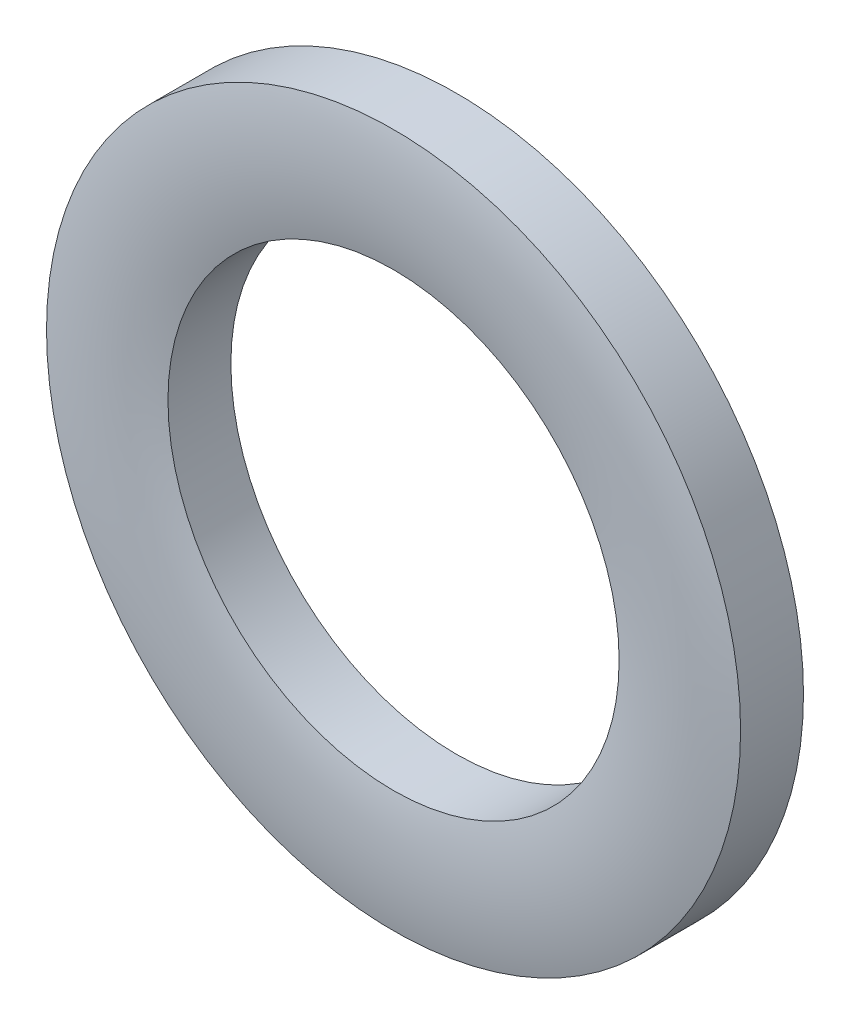
ISO-10303-21;
HEADER;
FILE_DESCRIPTION(('STEP AP214'),'2;1');
FILE_NAME('part.step','',(''),(''),'','','');
FILE_SCHEMA(('AUTOMOTIVE_DESIGN { 1 0 10303 214 1 1 1 1 }'));
ENDSEC;
DATA;
#1=APPLICATION_CONTEXT('core data for automotive mechanical design processes');
#2=APPLICATION_PROTOCOL_DEFINITION('international standard','automotive_design',2000,#1);
#3=PRODUCT_CONTEXT('',#1,'mechanical');
#4=PRODUCT('Part','Part','',(#3));
#5=PRODUCT_RELATED_PRODUCT_CATEGORY('part','',(#4));
#6=PRODUCT_DEFINITION_FORMATION('','',#4);
#7=PRODUCT_DEFINITION_CONTEXT('part definition',#1,'design');
#8=PRODUCT_DEFINITION('design','',#6,#7);
#9=PRODUCT_DEFINITION_SHAPE('','',#8);
#10=(LENGTH_UNIT() NAMED_UNIT(*) SI_UNIT(.MILLI.,.METRE.));
#11=(NAMED_UNIT(*) PLANE_ANGLE_UNIT() SI_UNIT($,.RADIAN.));
#12=(NAMED_UNIT(*) SI_UNIT($,.STERADIAN.) SOLID_ANGLE_UNIT());
#13=UNCERTAINTY_MEASURE_WITH_UNIT(LENGTH_MEASURE(1.E-05),#10,'distance_accuracy_value','');
#14=(GEOMETRIC_REPRESENTATION_CONTEXT(3) GLOBAL_UNCERTAINTY_ASSIGNED_CONTEXT((#13)) GLOBAL_UNIT_ASSIGNED_CONTEXT((#10,
#11,#12)) REPRESENTATION_CONTEXT('',''));
#15=CARTESIAN_POINT('',(0.,0.,0.));
#16=DIRECTION('',(0.,0.,1.));
#17=DIRECTION('',(1.,0.,0.));
#18=AXIS2_PLACEMENT_3D('',#15,#16,#17);
#19=CARTESIAN_POINT('',(0.,6.5,-0.999999999999999));
#20=DIRECTION('',(0.,0.,1.));
#21=DIRECTION('',(1.,0.,0.));
#22=AXIS2_PLACEMENT_3D('',#19,#20,#21);
#23=PLANE('',#22);
#24=CARTESIAN_POINT('',(0.,0.,-0.999999999999999));
#25=DIRECTION('',(0.,0.,1.));
#26=DIRECTION('',(1.,0.,0.));
#27=AXIS2_PLACEMENT_3D('',#24,#25,#26);
#28=CIRCLE('',#27,10.);
#29=CARTESIAN_POINT('',(10.,0.,-0.999999999999999));
#30=VERTEX_POINT('',#29);
#31=EDGE_CURVE('E44',#30,#30,#28,.T.);
#32=ORIENTED_EDGE('',*,*,#31,.F.);
#33=EDGE_LOOP('',(#32));
#34=FACE_BOUND('',#33,.T.);
#35=CARTESIAN_POINT('',(0.,0.,-0.999999999999999));
#36=DIRECTION('',(0.,0.,1.));
#37=DIRECTION('',(1.,0.,0.));
#38=AXIS2_PLACEMENT_3D('',#35,#36,#37);
#39=CIRCLE('',#38,6.5);
#40=CARTESIAN_POINT('',(6.5,0.,-0.999999999999999));
#41=VERTEX_POINT('',#40);
#42=EDGE_CURVE('E10',#41,#41,#39,.T.);
#43=ORIENTED_EDGE('',*,*,#42,.T.);
#44=EDGE_LOOP('',(#43));
#45=FACE_BOUND('',#44,.T.);
#46=ADVANCED_FACE('F30',(#34,#45),#23,.F.);
#47=CARTESIAN_POINT('',(0.,0.,1.));
#48=DIRECTION('',(0.,0.,1.));
#49=DIRECTION('',(1.,0.,0.));
#50=AXIS2_PLACEMENT_3D('',#47,#48,#49);
#51=CYLINDRICAL_SURFACE('',#50,6.5);
#52=ORIENTED_EDGE('',*,*,#42,.F.);
#53=EDGE_LOOP('',(#52));
#54=FACE_BOUND('',#53,.T.);
#55=CARTESIAN_POINT('',(0.,0.,0.812600000000001));
#56=DIRECTION('',(0.,0.,1.));
#57=DIRECTION('',(1.,0.,0.));
#58=AXIS2_PLACEMENT_3D('',#55,#56,#57);
#59=CIRCLE('',#58,6.5);
#60=CARTESIAN_POINT('',(6.5,0.,0.812600000000001));
#61=VERTEX_POINT('',#60);
#62=EDGE_CURVE('E36',#61,#61,#59,.T.);
#63=ORIENTED_EDGE('',*,*,#62,.T.);
#64=EDGE_LOOP('',(#63));
#65=FACE_BOUND('',#64,.T.);
#66=ADVANCED_FACE('F53',(#54,#65),#51,.F.);
#67=CARTESIAN_POINT('',(0.,0.,-7.26472454642477));
#68=DIRECTION('',(0.,0.,1.));
#69=DIRECTION('',(1.,0.,0.));
#70=AXIS2_PLACEMENT_3D('',#67,#68,#69);
#71=DEGENERATE_TOROIDAL_SURFACE('',#70,8.25,8.26472454642477,.T.);
#72=ORIENTED_EDGE('',*,*,#62,.F.);
#73=EDGE_LOOP('',(#72));
#74=FACE_BOUND('',#73,.T.);
#75=CARTESIAN_POINT('',(0.,0.,0.812600000000001));
#76=DIRECTION('',(0.,0.,1.));
#77=DIRECTION('',(1.,0.,0.));
#78=AXIS2_PLACEMENT_3D('',#75,#76,#77);
#79=CIRCLE('',#78,10.);
#80=CARTESIAN_POINT('',(10.,0.,0.812600000000001));
#81=VERTEX_POINT('',#80);
#82=EDGE_CURVE('E40',#81,#81,#79,.T.);
#83=ORIENTED_EDGE('',*,*,#82,.T.);
#84=EDGE_LOOP('',(#83));
#85=FACE_BOUND('',#84,.T.);
#86=ADVANCED_FACE('F57',(#74,#85),#71,.T.);
#87=CARTESIAN_POINT('',(0.,0.,1.));
#88=DIRECTION('',(0.,0.,1.));
#89=DIRECTION('',(1.,0.,0.));
#90=AXIS2_PLACEMENT_3D('',#87,#88,#89);
#91=CYLINDRICAL_SURFACE('',#90,10.);
#92=ORIENTED_EDGE('',*,*,#82,.F.);
#93=EDGE_LOOP('',(#92));
#94=FACE_BOUND('',#93,.T.);
#95=ORIENTED_EDGE('',*,*,#31,.T.);
#96=EDGE_LOOP('',(#95));
#97=FACE_BOUND('',#96,.T.);
#98=ADVANCED_FACE('F50',(#94,#97),#91,.T.);
#99=CLOSED_SHELL('',(#46,#66,#86,#98));
#100=MANIFOLD_SOLID_BREP('B2',#99);
#101=ADVANCED_BREP_SHAPE_REPRESENTATION('',(#18,#100),#14);
#102=SHAPE_DEFINITION_REPRESENTATION(#9,#101);
ENDSEC;
END-ISO-10303-21;
